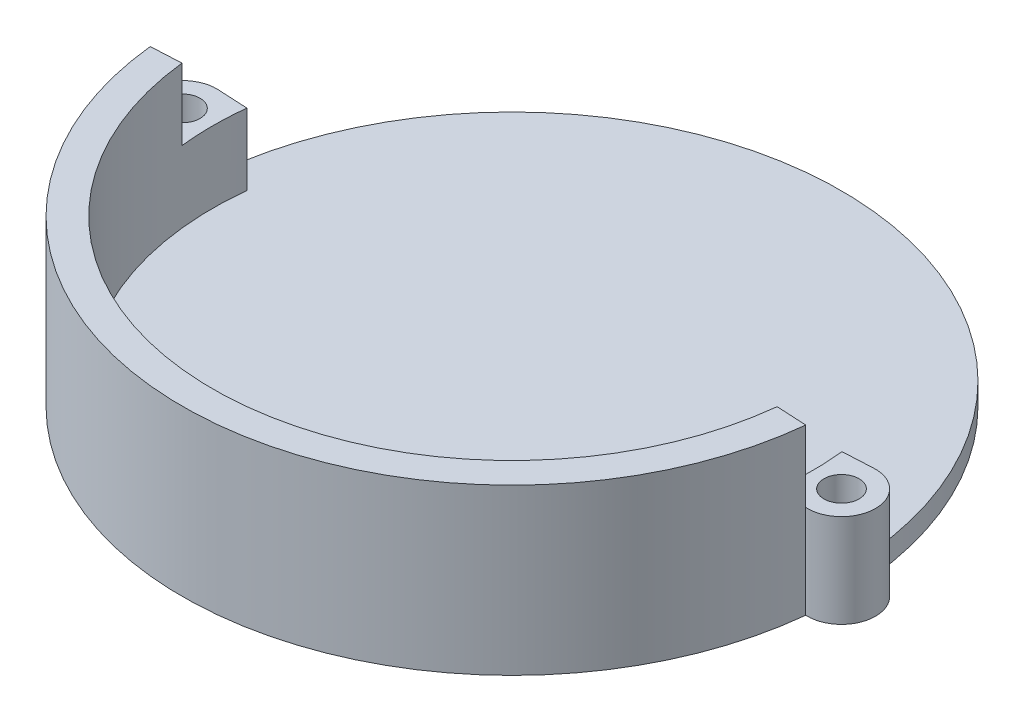
ISO-10303-21;
HEADER;
FILE_DESCRIPTION(('STEP AP214'),'2;1');
FILE_NAME('part.step','',(''),(''),'','','');
FILE_SCHEMA(('AUTOMOTIVE_DESIGN { 1 0 10303 214 1 1 1 1 }'));
ENDSEC;
DATA;
#1=APPLICATION_CONTEXT('core data for automotive mechanical design processes');
#2=APPLICATION_PROTOCOL_DEFINITION('international standard','automotive_design',2000,#1);
#3=PRODUCT_CONTEXT('',#1,'mechanical');
#4=PRODUCT('Part','Part','',(#3));
#5=PRODUCT_RELATED_PRODUCT_CATEGORY('part','',(#4));
#6=PRODUCT_DEFINITION_FORMATION('','',#4);
#7=PRODUCT_DEFINITION_CONTEXT('part definition',#1,'design');
#8=PRODUCT_DEFINITION('design','',#6,#7);
#9=PRODUCT_DEFINITION_SHAPE('','',#8);
#10=(LENGTH_UNIT() NAMED_UNIT(*) SI_UNIT(.MILLI.,.METRE.));
#11=(NAMED_UNIT(*) PLANE_ANGLE_UNIT() SI_UNIT($,.RADIAN.));
#12=(NAMED_UNIT(*) SI_UNIT($,.STERADIAN.) SOLID_ANGLE_UNIT());
#13=UNCERTAINTY_MEASURE_WITH_UNIT(LENGTH_MEASURE(1.E-05),#10,'distance_accuracy_value','');
#14=(GEOMETRIC_REPRESENTATION_CONTEXT(3) GLOBAL_UNCERTAINTY_ASSIGNED_CONTEXT((#13)) GLOBAL_UNIT_ASSIGNED_CONTEXT((#10,
#11,#12)) REPRESENTATION_CONTEXT('',''));
#15=CARTESIAN_POINT('',(0.,0.,0.));
#16=DIRECTION('',(0.,0.,1.));
#17=DIRECTION('',(1.,0.,0.));
#18=AXIS2_PLACEMENT_3D('',#15,#16,#17);
#19=CARTESIAN_POINT('',(0.,2.,0.));
#20=DIRECTION('',(0.,-1.,0.));
#21=DIRECTION('',(0.,0.,-1.));
#22=AXIS2_PLACEMENT_3D('',#19,#20,#21);
#23=CYLINDRICAL_SURFACE('',#22,30.);
#24=DIRECTION('',(0.,1.,0.));
#25=VECTOR('',#24,1.);
#26=CARTESIAN_POINT('',(29.8398333333333,-49.2199725990469,3.0958595961201));
#27=LINE('',#26,#25);
#28=CARTESIAN_POINT('',(29.8398333333333,8.5,3.0958595961201));
#29=VERTEX_POINT('',#28);
#30=CARTESIAN_POINT('',(29.8398333333333,15.,3.0958595961201));
#31=VERTEX_POINT('',#30);
#32=EDGE_CURVE('E126',#29,#31,#27,.T.);
#33=ORIENTED_EDGE('',*,*,#32,.T.);
#34=CARTESIAN_POINT('',(0.,15.,0.));
#35=DIRECTION('',(0.,1.,0.));
#36=DIRECTION('',(0.,0.,1.));
#37=AXIS2_PLACEMENT_3D('',#34,#35,#36);
#38=CIRCLE('',#37,30.);
#39=CARTESIAN_POINT('',(-29.8398333333333,15.,3.0958595961201));
#40=VERTEX_POINT('',#39);
#41=EDGE_CURVE('E138',#40,#31,#38,.T.);
#42=ORIENTED_EDGE('',*,*,#41,.F.);
#43=DIRECTION('',(0.,1.,0.));
#44=VECTOR('',#43,1.);
#45=CARTESIAN_POINT('',(-29.8398333333333,-49.2199725990469,3.0958595961201));
#46=LINE('',#45,#44);
#47=CARTESIAN_POINT('',(-29.8398333333333,8.5,3.0958595961201));
#48=VERTEX_POINT('',#47);
#49=EDGE_CURVE('E182',#48,#40,#46,.T.);
#50=ORIENTED_EDGE('',*,*,#49,.F.);
#51=DIRECTION('',(0.,-1.,0.));
#52=VECTOR('',#51,1.);
#53=CARTESIAN_POINT('',(-29.8398333333333,8.5,3.0958595961201));
#54=LINE('',#53,#52);
#55=CARTESIAN_POINT('',(-29.8398333333333,0.,3.0958595961201));
#56=VERTEX_POINT('',#55);
#57=EDGE_CURVE('E153',#48,#56,#54,.T.);
#58=ORIENTED_EDGE('',*,*,#57,.T.);
#59=CARTESIAN_POINT('',(0.,0.,0.));
#60=DIRECTION('',(0.,1.,0.));
#61=DIRECTION('',(0.,0.,1.));
#62=AXIS2_PLACEMENT_3D('',#59,#60,#61);
#63=CIRCLE('',#62,30.);
#64=CARTESIAN_POINT('',(29.8398333333333,0.,3.0958595961201));
#65=VERTEX_POINT('',#64);
#66=EDGE_CURVE('E43',#56,#65,#63,.T.);
#67=ORIENTED_EDGE('',*,*,#66,.T.);
#68=DIRECTION('',(0.,-1.,0.));
#69=VECTOR('',#68,1.);
#70=CARTESIAN_POINT('',(29.8398333333333,10.1773592914337,3.0958595961201));
#71=LINE('',#70,#69);
#72=EDGE_CURVE('E140',#29,#65,#71,.T.);
#73=ORIENTED_EDGE('',*,*,#72,.F.);
#74=EDGE_LOOP('',(#33,#42,#50,#58,#67,#73));
#75=FACE_BOUND('',#74,.T.);
#76=ADVANCED_FACE('F35',(#75),#23,.T.);
#77=CARTESIAN_POINT('',(0.,15.,0.));
#78=DIRECTION('',(0.,-1.,0.));
#79=DIRECTION('',(0.,0.,-1.));
#80=AXIS2_PLACEMENT_3D('',#77,#78,#79);
#81=CYLINDRICAL_SURFACE('',#80,27.25);
#82=CARTESIAN_POINT('',(0.,15.,0.));
#83=DIRECTION('',(0.,1.,0.));
#84=DIRECTION('',(0.,0.,1.));
#85=AXIS2_PLACEMENT_3D('',#82,#83,#84);
#86=CIRCLE('',#85,27.25);
#87=CARTESIAN_POINT('',(-27.0894618229625,15.,2.95356702010563));
#88=VERTEX_POINT('',#87);
#89=CARTESIAN_POINT('',(27.0894618229625,15.,2.95356702010563));
#90=VERTEX_POINT('',#89);
#91=EDGE_CURVE('E146',#88,#90,#86,.T.);
#92=ORIENTED_EDGE('',*,*,#91,.T.);
#93=DIRECTION('',(0.,-1.,0.));
#94=VECTOR('',#93,1.);
#95=CARTESIAN_POINT('',(27.0894618229625,15.,2.95356702010563));
#96=LINE('',#95,#94);
#97=CARTESIAN_POINT('',(27.0894618229625,8.5,2.95356702010563));
#98=VERTEX_POINT('',#97);
#99=EDGE_CURVE('E129',#90,#98,#96,.T.);
#100=ORIENTED_EDGE('',*,*,#99,.T.);
#101=CARTESIAN_POINT('',(0.,8.5,0.));
#102=DIRECTION('',(0.,1.,0.));
#103=DIRECTION('',(0.,0.,1.));
#104=AXIS2_PLACEMENT_3D('',#101,#102,#103);
#105=CIRCLE('',#104,27.25);
#106=CARTESIAN_POINT('',(27.0894618229625,8.5,-2.95356702010562));
#107=VERTEX_POINT('',#106);
#108=EDGE_CURVE('E226',#98,#107,#105,.T.);
#109=ORIENTED_EDGE('',*,*,#108,.T.);
#110=DIRECTION('',(0.,-1.,0.));
#111=VECTOR('',#110,1.);
#112=CARTESIAN_POINT('',(27.0894618229625,8.5,-2.95356702010562));
#113=LINE('',#112,#111);
#114=CARTESIAN_POINT('',(27.0894618229625,2.,-2.95356702010562));
#115=VERTEX_POINT('',#114);
#116=EDGE_CURVE('E240',#107,#115,#113,.T.);
#117=ORIENTED_EDGE('',*,*,#116,.T.);
#118=CARTESIAN_POINT('',(0.,2.,0.));
#119=DIRECTION('',(0.,1.,0.));
#120=DIRECTION('',(0.,0.,1.));
#121=AXIS2_PLACEMENT_3D('',#118,#119,#120);
#122=CIRCLE('',#121,27.25);
#123=CARTESIAN_POINT('',(-27.0894618229625,2.,-2.95356702010562));
#124=VERTEX_POINT('',#123);
#125=EDGE_CURVE('E11',#115,#124,#122,.F.);
#126=ORIENTED_EDGE('',*,*,#125,.T.);
#127=DIRECTION('',(0.,-1.,0.));
#128=VECTOR('',#127,1.);
#129=CARTESIAN_POINT('',(-27.0894618229625,8.5,-2.95356702010562));
#130=LINE('',#129,#128);
#131=CARTESIAN_POINT('',(-27.0894618229625,8.5,-2.95356702010562));
#132=VERTEX_POINT('',#131);
#133=EDGE_CURVE('E206',#132,#124,#130,.T.);
#134=ORIENTED_EDGE('',*,*,#133,.F.);
#135=CARTESIAN_POINT('',(0.,8.5,0.));
#136=DIRECTION('',(0.,-1.,0.));
#137=DIRECTION('',(0.,0.,1.));
#138=AXIS2_PLACEMENT_3D('',#135,#136,#137);
#139=CIRCLE('',#138,27.25);
#140=CARTESIAN_POINT('',(-27.2496284896292,8.5,0.14229257601455));
#141=VERTEX_POINT('',#140);
#142=EDGE_CURVE('E50',#141,#132,#139,.T.);
#143=ORIENTED_EDGE('',*,*,#142,.F.);
#144=CARTESIAN_POINT('',(-27.0894618229625,8.5,2.95356702010563));
#145=VERTEX_POINT('',#144);
#146=EDGE_CURVE('E195',#145,#141,#139,.T.);
#147=ORIENTED_EDGE('',*,*,#146,.F.);
#148=DIRECTION('',(0.,-1.,0.));
#149=VECTOR('',#148,1.);
#150=CARTESIAN_POINT('',(-27.0894618229625,15.,2.95356702010563));
#151=LINE('',#150,#149);
#152=EDGE_CURVE('E186',#88,#145,#151,.T.);
#153=ORIENTED_EDGE('',*,*,#152,.F.);
#154=EDGE_LOOP('',(#92,#100,#109,#117,#126,#134,#143,#147,#153));
#155=FACE_BOUND('',#154,.T.);
#156=ADVANCED_FACE('F225',(#155),#81,.F.);
#157=CARTESIAN_POINT('',(0.,15.,0.));
#158=DIRECTION('',(0.,1.,0.));
#159=DIRECTION('',(0.,0.,1.));
#160=AXIS2_PLACEMENT_3D('',#157,#158,#159);
#161=PLANE('',#160);
#162=ORIENTED_EDGE('',*,*,#41,.T.);
#163=DIRECTION('',(-0.998664385845193,0.,-0.0516666666666654));
#164=VECTOR('',#163,1.);
#165=CARTESIAN_POINT('',(29.8398333333333,15.,3.0958595961201));
#166=LINE('',#165,#164);
#167=EDGE_CURVE('E122',#31,#90,#166,.T.);
#168=ORIENTED_EDGE('',*,*,#167,.T.);
#169=ORIENTED_EDGE('',*,*,#91,.F.);
#170=DIRECTION('',(0.998664385845193,0.,-0.0516666666666654));
#171=VECTOR('',#170,1.);
#172=CARTESIAN_POINT('',(-29.8398333333333,15.,3.0958595961201));
#173=LINE('',#172,#171);
#174=EDGE_CURVE('E73',#40,#88,#173,.T.);
#175=ORIENTED_EDGE('',*,*,#174,.F.);
#176=EDGE_LOOP('',(#162,#168,#169,#175));
#177=FACE_BOUND('',#176,.T.);
#178=ADVANCED_FACE('F144',(#177),#161,.T.);
#179=CARTESIAN_POINT('',(30.,10.1773592914337,0.));
#180=DIRECTION('',(0.,-1.,0.));
#181=DIRECTION('',(0.,0.,-1.));
#182=AXIS2_PLACEMENT_3D('',#179,#180,#181);
#183=CYLINDRICAL_SURFACE('',#182,1.6);
#184=CARTESIAN_POINT('',(30.,0.,0.));
#185=DIRECTION('',(0.,-1.,0.));
#186=DIRECTION('',(0.,0.,1.));
#187=AXIS2_PLACEMENT_3D('',#184,#185,#186);
#188=CIRCLE('',#187,1.6);
#189=CARTESIAN_POINT('',(30.,0.,1.6));
#190=VERTEX_POINT('',#189);
#191=EDGE_CURVE('E167',#190,#190,#188,.T.);
#192=ORIENTED_EDGE('',*,*,#191,.T.);
#193=EDGE_LOOP('',(#192));
#194=FACE_BOUND('',#193,.T.);
#195=CARTESIAN_POINT('',(30.,8.5,2.09488880330588E-13));
#196=DIRECTION('',(0.,1.,0.));
#197=DIRECTION('',(0.,0.,1.));
#198=AXIS2_PLACEMENT_3D('',#195,#196,#197);
#199=CIRCLE('',#198,1.6);
#200=CARTESIAN_POINT('',(30.,8.5,1.60000000000021));
#201=VERTEX_POINT('',#200);
#202=EDGE_CURVE('E228',#201,#201,#199,.F.);
#203=ORIENTED_EDGE('',*,*,#202,.F.);
#204=EDGE_LOOP('',(#203));
#205=FACE_BOUND('',#204,.T.);
#206=ADVANCED_FACE('F278',(#194,#205),#183,.F.);
#207=CARTESIAN_POINT('',(0.,0.,0.));
#208=DIRECTION('',(0.,1.,0.));
#209=DIRECTION('',(0.,0.,1.));
#210=AXIS2_PLACEMENT_3D('',#207,#208,#209);
#211=PLANE('',#210);
#212=CARTESIAN_POINT('',(-30.,0.,2.09488880330588E-13));
#213=DIRECTION('',(0.,1.,0.));
#214=DIRECTION('',(0.,0.,1.));
#215=AXIS2_PLACEMENT_3D('',#212,#213,#214);
#216=CIRCLE('',#215,1.6);
#217=CARTESIAN_POINT('',(-30.,0.,1.60000000000021));
#218=VERTEX_POINT('',#217);
#219=EDGE_CURVE('E188',#218,#218,#216,.T.);
#220=ORIENTED_EDGE('',*,*,#219,.T.);
#221=EDGE_LOOP('',(#220));
#222=FACE_BOUND('',#221,.T.);
#223=CARTESIAN_POINT('',(29.8398333333333,0.,-3.0958595961201));
#224=VERTEX_POINT('',#223);
#225=CARTESIAN_POINT('',(-29.8398333333333,0.,-3.0958595961201));
#226=VERTEX_POINT('',#225);
#227=EDGE_CURVE('E145',#224,#226,#63,.T.);
#228=ORIENTED_EDGE('',*,*,#227,.F.);
#229=CARTESIAN_POINT('',(30.,0.,0.));
#230=DIRECTION('',(0.,-1.,0.));
#231=DIRECTION('',(0.,0.,-1.));
#232=AXIS2_PLACEMENT_3D('',#229,#230,#231);
#233=CIRCLE('',#232,3.1);
#234=EDGE_CURVE('E162',#224,#65,#233,.T.);
#235=ORIENTED_EDGE('',*,*,#234,.T.);
#236=ORIENTED_EDGE('',*,*,#66,.F.);
#237=CARTESIAN_POINT('',(-30.,0.,0.));
#238=DIRECTION('',(0.,-1.,0.));
#239=DIRECTION('',(0.,0.,1.));
#240=AXIS2_PLACEMENT_3D('',#237,#238,#239);
#241=CIRCLE('',#240,3.1);
#242=EDGE_CURVE('E161',#56,#226,#241,.T.);
#243=ORIENTED_EDGE('',*,*,#242,.T.);
#244=EDGE_LOOP('',(#228,#235,#236,#243));
#245=FACE_BOUND('',#244,.T.);
#246=ORIENTED_EDGE('',*,*,#191,.F.);
#247=EDGE_LOOP('',(#246));
#248=FACE_BOUND('',#247,.T.);
#249=ADVANCED_FACE('F159',(#222,#245,#248),#211,.F.);
#250=CARTESIAN_POINT('',(-30.,0.,2.09488880330588E-13));
#251=DIRECTION('',(0.,1.,0.));
#252=DIRECTION('',(0.,0.,1.));
#253=AXIS2_PLACEMENT_3D('',#250,#251,#252);
#254=CYLINDRICAL_SURFACE('',#253,1.6);
#255=ORIENTED_EDGE('',*,*,#219,.F.);
#256=EDGE_LOOP('',(#255));
#257=FACE_BOUND('',#256,.T.);
#258=CARTESIAN_POINT('',(-30.,8.5,2.09488880330588E-13));
#259=DIRECTION('',(0.,1.,0.));
#260=DIRECTION('',(0.,0.,1.));
#261=AXIS2_PLACEMENT_3D('',#258,#259,#260);
#262=CIRCLE('',#261,1.6);
#263=CARTESIAN_POINT('',(-30.,8.5,1.60000000000021));
#264=VERTEX_POINT('',#263);
#265=EDGE_CURVE('E191',#264,#264,#262,.T.);
#266=ORIENTED_EDGE('',*,*,#265,.T.);
#267=EDGE_LOOP('',(#266));
#268=FACE_BOUND('',#267,.T.);
#269=ADVANCED_FACE('F269',(#257,#268),#254,.F.);
#270=CARTESIAN_POINT('',(0.,2.,0.));
#271=DIRECTION('',(0.,1.,0.));
#272=DIRECTION('',(0.,0.,1.));
#273=AXIS2_PLACEMENT_3D('',#270,#271,#272);
#274=PLANE('',#273);
#275=ORIENTED_EDGE('',*,*,#125,.F.);
#276=DIRECTION('',(0.998664385845193,0.,-0.0516666666666673));
#277=VECTOR('',#276,1.);
#278=CARTESIAN_POINT('',(27.0894618229625,2.,-2.95356702010562));
#279=LINE('',#278,#277);
#280=CARTESIAN_POINT('',(29.8398333333333,2.,-3.0958595961201));
#281=VERTEX_POINT('',#280);
#282=EDGE_CURVE('E214',#115,#281,#279,.T.);
#283=ORIENTED_EDGE('',*,*,#282,.T.);
#284=CARTESIAN_POINT('',(0.,2.,0.));
#285=DIRECTION('',(0.,1.,0.));
#286=DIRECTION('',(0.,0.,1.));
#287=AXIS2_PLACEMENT_3D('',#284,#285,#286);
#288=CIRCLE('',#287,30.);
#289=CARTESIAN_POINT('',(-29.8398333333333,2.,-3.0958595961201));
#290=VERTEX_POINT('',#289);
#291=EDGE_CURVE('E148',#281,#290,#288,.T.);
#292=ORIENTED_EDGE('',*,*,#291,.T.);
#293=DIRECTION('',(-0.998664385845193,0.,-0.0516666666666673));
#294=VECTOR('',#293,1.);
#295=CARTESIAN_POINT('',(-27.0894618229625,2.,-2.95356702010562));
#296=LINE('',#295,#294);
#297=EDGE_CURVE('E194',#124,#290,#296,.T.);
#298=ORIENTED_EDGE('',*,*,#297,.F.);
#299=EDGE_LOOP('',(#275,#283,#292,#298));
#300=FACE_BOUND('',#299,.T.);
#301=ADVANCED_FACE('F212',(#300),#274,.T.);
#302=ORIENTED_EDGE('',*,*,#291,.F.);
#303=DIRECTION('',(0.,-1.,0.));
#304=VECTOR('',#303,1.);
#305=CARTESIAN_POINT('',(29.8398333333333,10.1773592914337,-3.0958595961201));
#306=LINE('',#305,#304);
#307=EDGE_CURVE('E172',#281,#224,#306,.T.);
#308=ORIENTED_EDGE('',*,*,#307,.T.);
#309=ORIENTED_EDGE('',*,*,#227,.T.);
#310=DIRECTION('',(0.,-1.,0.));
#311=VECTOR('',#310,1.);
#312=CARTESIAN_POINT('',(-29.8398333333333,10.1773592914337,-3.0958595961201));
#313=LINE('',#312,#311);
#314=EDGE_CURVE('E166',#290,#226,#313,.T.);
#315=ORIENTED_EDGE('',*,*,#314,.F.);
#316=EDGE_LOOP('',(#302,#308,#309,#315));
#317=FACE_BOUND('',#316,.T.);
#318=ADVANCED_FACE('F37',(#317),#23,.T.);
#319=CARTESIAN_POINT('',(0.,8.5,0.));
#320=DIRECTION('',(0.,1.,0.));
#321=DIRECTION('',(0.,0.,1.));
#322=AXIS2_PLACEMENT_3D('',#319,#320,#321);
#323=PLANE('',#322);
#324=CARTESIAN_POINT('',(-30.,8.5,0.));
#325=DIRECTION('',(0.,1.,0.));
#326=DIRECTION('',(0.,0.,-1.));
#327=AXIS2_PLACEMENT_3D('',#324,#325,#326);
#328=CIRCLE('',#327,3.1);
#329=CARTESIAN_POINT('',(-29.8398333333333,8.5,-3.0958595961201));
#330=VERTEX_POINT('',#329);
#331=EDGE_CURVE('E198',#330,#48,#328,.T.);
#332=ORIENTED_EDGE('',*,*,#331,.T.);
#333=DIRECTION('',(-0.998664385845193,0.,0.0516666666666654));
#334=VECTOR('',#333,1.);
#335=CARTESIAN_POINT('',(-29.8398333333333,8.5,3.0958595961201));
#336=LINE('',#335,#334);
#337=EDGE_CURVE('E184',#145,#48,#336,.T.);
#338=ORIENTED_EDGE('',*,*,#337,.F.);
#339=ORIENTED_EDGE('',*,*,#146,.T.);
#340=ORIENTED_EDGE('',*,*,#142,.T.);
#341=DIRECTION('',(-0.998664385845193,0.,-0.0516666666666673));
#342=VECTOR('',#341,1.);
#343=CARTESIAN_POINT('',(-27.0894618229625,8.5,-2.95356702010562));
#344=LINE('',#343,#342);
#345=EDGE_CURVE('E58',#132,#330,#344,.T.);
#346=ORIENTED_EDGE('',*,*,#345,.T.);
#347=EDGE_LOOP('',(#332,#338,#339,#340,#346));
#348=FACE_BOUND('',#347,.T.);
#349=ORIENTED_EDGE('',*,*,#265,.F.);
#350=EDGE_LOOP('',(#349));
#351=FACE_BOUND('',#350,.T.);
#352=ADVANCED_FACE('F222',(#348,#351),#323,.T.);
#353=CARTESIAN_POINT('',(-27.0894618229625,8.5,-2.95356702010562));
#354=DIRECTION('',(-0.0516666666666673,0.,0.998664385845192));
#355=DIRECTION('',(0.998664385845193,0.,0.0516666666666673));
#356=AXIS2_PLACEMENT_3D('',#353,#354,#355);
#357=PLANE('',#356);
#358=ORIENTED_EDGE('',*,*,#297,.T.);
#359=DIRECTION('',(0.,-1.,0.));
#360=VECTOR('',#359,1.);
#361=CARTESIAN_POINT('',(-29.8398333333333,8.5,-3.0958595961201));
#362=LINE('',#361,#360);
#363=EDGE_CURVE('E203',#330,#290,#362,.T.);
#364=ORIENTED_EDGE('',*,*,#363,.F.);
#365=ORIENTED_EDGE('',*,*,#345,.F.);
#366=ORIENTED_EDGE('',*,*,#133,.T.);
#367=EDGE_LOOP('',(#358,#364,#365,#366));
#368=FACE_BOUND('',#367,.T.);
#369=ADVANCED_FACE('F218',(#368),#357,.F.);
#370=CARTESIAN_POINT('',(-30.,8.5,0.));
#371=DIRECTION('',(0.,-1.,0.));
#372=DIRECTION('',(0.,0.,-1.));
#373=AXIS2_PLACEMENT_3D('',#370,#371,#372);
#374=CYLINDRICAL_SURFACE('',#373,3.1);
#375=ORIENTED_EDGE('',*,*,#363,.T.);
#376=ORIENTED_EDGE('',*,*,#314,.T.);
#377=ORIENTED_EDGE('',*,*,#242,.F.);
#378=ORIENTED_EDGE('',*,*,#57,.F.);
#379=ORIENTED_EDGE('',*,*,#331,.F.);
#380=EDGE_LOOP('',(#375,#376,#377,#378,#379));
#381=FACE_BOUND('',#380,.T.);
#382=ADVANCED_FACE('F220',(#381),#374,.T.);
#383=CARTESIAN_POINT('',(-29.8398333333333,-49.2199725990469,3.0958595961201));
#384=DIRECTION('',(0.0516666666666653,0.,0.998664385845193));
#385=DIRECTION('',(0.998664385845193,0.,-0.0516666666666654));
#386=AXIS2_PLACEMENT_3D('',#383,#384,#385);
#387=PLANE('',#386);
#388=ORIENTED_EDGE('',*,*,#152,.T.);
#389=ORIENTED_EDGE('',*,*,#337,.T.);
#390=ORIENTED_EDGE('',*,*,#49,.T.);
#391=ORIENTED_EDGE('',*,*,#174,.T.);
#392=EDGE_LOOP('',(#388,#389,#390,#391));
#393=FACE_BOUND('',#392,.T.);
#394=ADVANCED_FACE('F224',(#393),#387,.F.);
#395=CARTESIAN_POINT('',(30.,10.1773592914337,0.));
#396=DIRECTION('',(0.,-1.,0.));
#397=DIRECTION('',(0.,0.,-1.));
#398=AXIS2_PLACEMENT_3D('',#395,#396,#397);
#399=CYLINDRICAL_SURFACE('',#398,3.1);
#400=ORIENTED_EDGE('',*,*,#307,.F.);
#401=DIRECTION('',(0.,-1.,0.));
#402=VECTOR('',#401,1.);
#403=CARTESIAN_POINT('',(29.8398333333333,8.5,-3.0958595961201));
#404=LINE('',#403,#402);
#405=CARTESIAN_POINT('',(29.8398333333333,8.5,-3.0958595961201));
#406=VERTEX_POINT('',#405);
#407=EDGE_CURVE('E175',#406,#281,#404,.T.);
#408=ORIENTED_EDGE('',*,*,#407,.F.);
#409=CARTESIAN_POINT('',(30.,8.5,0.));
#410=DIRECTION('',(0.,-1.,0.));
#411=DIRECTION('',(0.,0.,-1.));
#412=AXIS2_PLACEMENT_3D('',#409,#410,#411);
#413=CIRCLE('',#412,3.1);
#414=EDGE_CURVE('E235',#406,#29,#413,.T.);
#415=ORIENTED_EDGE('',*,*,#414,.T.);
#416=ORIENTED_EDGE('',*,*,#72,.T.);
#417=ORIENTED_EDGE('',*,*,#234,.F.);
#418=EDGE_LOOP('',(#400,#408,#415,#416,#417));
#419=FACE_BOUND('',#418,.T.);
#420=ADVANCED_FACE('F245',(#419),#399,.T.);
#421=CARTESIAN_POINT('',(0.,8.5,0.));
#422=DIRECTION('',(0.,1.,0.));
#423=DIRECTION('',(0.,0.,1.));
#424=AXIS2_PLACEMENT_3D('',#421,#422,#423);
#425=PLANE('',#424);
#426=ORIENTED_EDGE('',*,*,#202,.T.);
#427=EDGE_LOOP('',(#426));
#428=FACE_BOUND('',#427,.T.);
#429=DIRECTION('',(0.998664385845193,0.,0.0516666666666654));
#430=VECTOR('',#429,1.);
#431=CARTESIAN_POINT('',(29.8398333333333,8.5,3.0958595961201));
#432=LINE('',#431,#430);
#433=EDGE_CURVE('E142',#98,#29,#432,.T.);
#434=ORIENTED_EDGE('',*,*,#433,.T.);
#435=ORIENTED_EDGE('',*,*,#414,.F.);
#436=DIRECTION('',(0.998664385845193,0.,-0.0516666666666673));
#437=VECTOR('',#436,1.);
#438=CARTESIAN_POINT('',(27.0894618229625,8.5,-2.95356702010562));
#439=LINE('',#438,#437);
#440=EDGE_CURVE('E237',#107,#406,#439,.T.);
#441=ORIENTED_EDGE('',*,*,#440,.F.);
#442=ORIENTED_EDGE('',*,*,#108,.F.);
#443=EDGE_LOOP('',(#434,#435,#441,#442));
#444=FACE_BOUND('',#443,.T.);
#445=ADVANCED_FACE('F247',(#428,#444),#425,.T.);
#446=CARTESIAN_POINT('',(27.0894618229625,8.5,-2.95356702010562));
#447=DIRECTION('',(-0.0516666666666673,0.,-0.998664385845192));
#448=DIRECTION('',(-0.998664385845193,0.,0.0516666666666673));
#449=AXIS2_PLACEMENT_3D('',#446,#447,#448);
#450=PLANE('',#449);
#451=ORIENTED_EDGE('',*,*,#282,.F.);
#452=ORIENTED_EDGE('',*,*,#116,.F.);
#453=ORIENTED_EDGE('',*,*,#440,.T.);
#454=ORIENTED_EDGE('',*,*,#407,.T.);
#455=EDGE_LOOP('',(#451,#452,#453,#454));
#456=FACE_BOUND('',#455,.T.);
#457=ADVANCED_FACE('F242',(#456),#450,.T.);
#458=CARTESIAN_POINT('',(29.8398333333333,-49.2199725990469,3.0958595961201));
#459=DIRECTION('',(0.0516666666666653,0.,-0.998664385845193));
#460=DIRECTION('',(-0.998664385845193,0.,-0.0516666666666654));
#461=AXIS2_PLACEMENT_3D('',#458,#459,#460);
#462=PLANE('',#461);
#463=ORIENTED_EDGE('',*,*,#167,.F.);
#464=ORIENTED_EDGE('',*,*,#32,.F.);
#465=ORIENTED_EDGE('',*,*,#433,.F.);
#466=ORIENTED_EDGE('',*,*,#99,.F.);
#467=EDGE_LOOP('',(#463,#464,#465,#466));
#468=FACE_BOUND('',#467,.T.);
#469=ADVANCED_FACE('F124',(#468),#462,.T.);
#470=CLOSED_SHELL('',(#76,#156,#178,#206,#249,#269,#301,#318,#352,#369,#382,#394,#420,#445,#457,#469));
#471=MANIFOLD_SOLID_BREP('B2',#470);
#472=ADVANCED_BREP_SHAPE_REPRESENTATION('',(#18,#471),#14);
#473=SHAPE_DEFINITION_REPRESENTATION(#9,#472);
ENDSEC;
END-ISO-10303-21;
